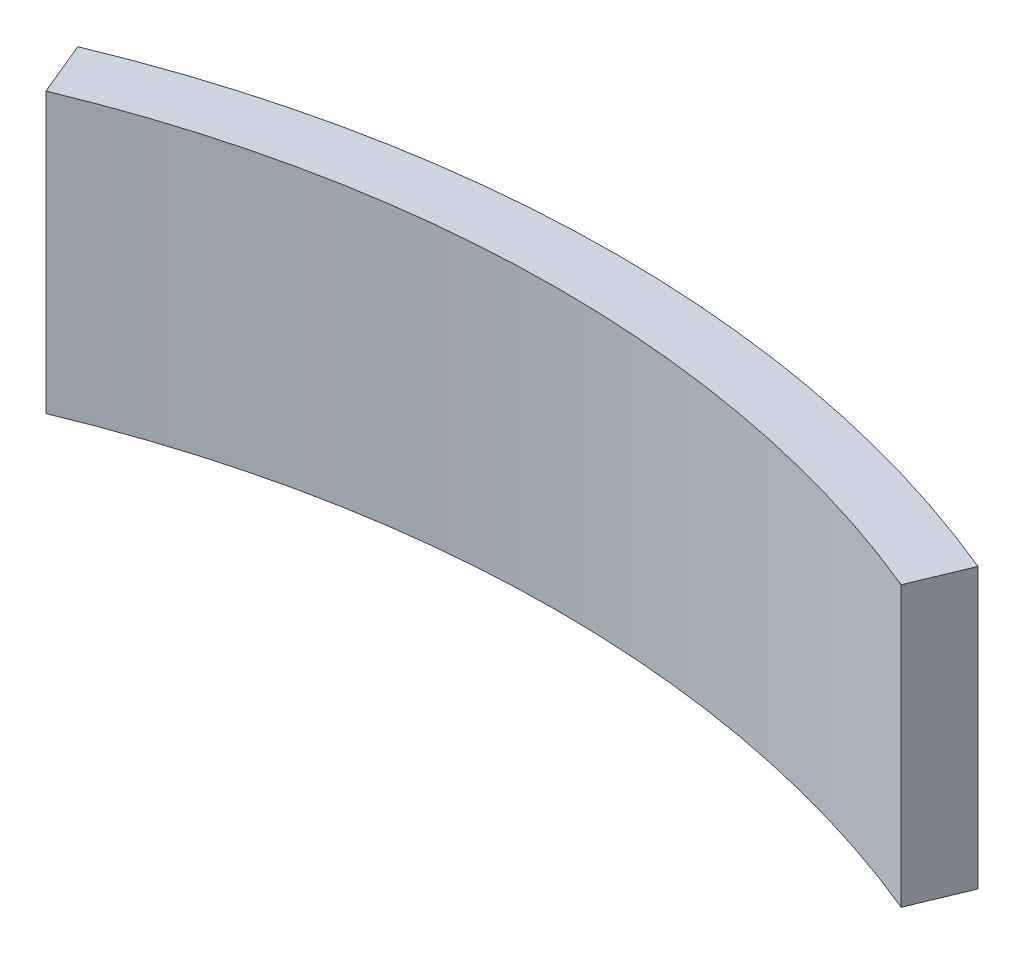
ISO-10303-21;
HEADER;
FILE_DESCRIPTION(('STEP AP214'),'2;1');
FILE_NAME('part.step','',(''),(''),'','','');
FILE_SCHEMA(('AUTOMOTIVE_DESIGN { 1 0 10303 214 1 1 1 1 }'));
ENDSEC;
DATA;
#1=APPLICATION_CONTEXT('core data for automotive mechanical design processes');
#2=APPLICATION_PROTOCOL_DEFINITION('international standard','automotive_design',2000,#1);
#3=PRODUCT_CONTEXT('',#1,'mechanical');
#4=PRODUCT('Part','Part','',(#3));
#5=PRODUCT_RELATED_PRODUCT_CATEGORY('part','',(#4));
#6=PRODUCT_DEFINITION_FORMATION('','',#4);
#7=PRODUCT_DEFINITION_CONTEXT('part definition',#1,'design');
#8=PRODUCT_DEFINITION('design','',#6,#7);
#9=PRODUCT_DEFINITION_SHAPE('','',#8);
#10=(LENGTH_UNIT() NAMED_UNIT(*) SI_UNIT(.MILLI.,.METRE.));
#11=(NAMED_UNIT(*) PLANE_ANGLE_UNIT() SI_UNIT($,.RADIAN.));
#12=(NAMED_UNIT(*) SI_UNIT($,.STERADIAN.) SOLID_ANGLE_UNIT());
#13=UNCERTAINTY_MEASURE_WITH_UNIT(LENGTH_MEASURE(1.E-05),#10,'distance_accuracy_value','');
#14=(GEOMETRIC_REPRESENTATION_CONTEXT(3) GLOBAL_UNCERTAINTY_ASSIGNED_CONTEXT((#13)) GLOBAL_UNIT_ASSIGNED_CONTEXT((#10,
#11,#12)) REPRESENTATION_CONTEXT('',''));
#15=CARTESIAN_POINT('',(0.,0.,0.));
#16=DIRECTION('',(0.,0.,1.));
#17=DIRECTION('',(1.,0.,0.));
#18=AXIS2_PLACEMENT_3D('',#15,#16,#17);
#19=CARTESIAN_POINT('',(0.,9.5,0.));
#20=DIRECTION('',(0.,-1.,0.));
#21=DIRECTION('',(0.,0.,-1.));
#22=AXIS2_PLACEMENT_3D('',#19,#20,#21);
#23=CYLINDRICAL_SURFACE('',#22,80.);
#24=CARTESIAN_POINT('',(0.,-9.5,0.));
#25=DIRECTION('',(0.,1.,0.));
#26=DIRECTION('',(0.,0.,1.));
#27=AXIS2_PLACEMENT_3D('',#24,#25,#26);
#28=CIRCLE('',#27,80.);
#29=CARTESIAN_POINT('',(30.6146745892072,-9.5,-73.9103626009029));
#30=VERTEX_POINT('',#29);
#31=CARTESIAN_POINT('',(-30.6146745892072,-9.5,-73.9103626009029));
#32=VERTEX_POINT('',#31);
#33=EDGE_CURVE('E98',#30,#32,#28,.T.);
#34=ORIENTED_EDGE('',*,*,#33,.T.);
#35=DIRECTION('',(0.,-1.,0.));
#36=VECTOR('',#35,1.);
#37=CARTESIAN_POINT('',(-30.6146745892072,9.5,-73.9103626009029));
#38=LINE('',#37,#36);
#39=CARTESIAN_POINT('',(-30.6146745892072,9.5,-73.9103626009029));
#40=VERTEX_POINT('',#39);
#41=EDGE_CURVE('E11',#40,#32,#38,.T.);
#42=ORIENTED_EDGE('',*,*,#41,.F.);
#43=CARTESIAN_POINT('',(0.,9.5,0.));
#44=DIRECTION('',(0.,1.,0.));
#45=DIRECTION('',(0.,0.,1.));
#46=AXIS2_PLACEMENT_3D('',#43,#44,#45);
#47=CIRCLE('',#46,80.);
#48=CARTESIAN_POINT('',(30.6146745892072,9.5,-73.9103626009029));
#49=VERTEX_POINT('',#48);
#50=EDGE_CURVE('E86',#49,#40,#47,.T.);
#51=ORIENTED_EDGE('',*,*,#50,.F.);
#52=DIRECTION('',(0.,-1.,0.));
#53=VECTOR('',#52,1.);
#54=CARTESIAN_POINT('',(30.6146745892072,9.5,-73.9103626009029));
#55=LINE('',#54,#53);
#56=EDGE_CURVE('E94',#49,#30,#55,.T.);
#57=ORIENTED_EDGE('',*,*,#56,.T.);
#58=EDGE_LOOP('',(#34,#42,#51,#57));
#59=FACE_BOUND('',#58,.T.);
#60=ADVANCED_FACE('F35',(#59),#23,.T.);
#61=CARTESIAN_POINT('',(-30.6146745892072,9.5,-73.9103626009029));
#62=DIRECTION('',(0.923879532511287,0.,-0.38268343236509));
#63=DIRECTION('',(-0.38268343236509,0.,-0.923879532511287));
#64=AXIS2_PLACEMENT_3D('',#61,#62,#63);
#65=PLANE('',#64);
#66=DIRECTION('',(0.38268343236509,0.,0.923879532511287));
#67=VECTOR('',#66,1.);
#68=CARTESIAN_POINT('',(-30.6146745892072,-9.5,-73.9103626009029));
#69=LINE('',#68,#67);
#70=CARTESIAN_POINT('',(-29.0839408597469,-9.5,-70.2148444708578));
#71=VERTEX_POINT('',#70);
#72=EDGE_CURVE('E90',#32,#71,#69,.T.);
#73=ORIENTED_EDGE('',*,*,#72,.T.);
#74=DIRECTION('',(0.,-1.,0.));
#75=VECTOR('',#74,1.);
#76=CARTESIAN_POINT('',(-29.0839408597469,9.5,-70.2148444708578));
#77=LINE('',#76,#75);
#78=CARTESIAN_POINT('',(-29.0839408597469,9.5,-70.2148444708578));
#79=VERTEX_POINT('',#78);
#80=EDGE_CURVE('E43',#79,#71,#77,.T.);
#81=ORIENTED_EDGE('',*,*,#80,.F.);
#82=DIRECTION('',(0.38268343236509,0.,0.923879532511287));
#83=VECTOR('',#82,1.);
#84=CARTESIAN_POINT('',(-30.6146745892072,9.5,-73.9103626009029));
#85=LINE('',#84,#83);
#86=EDGE_CURVE('E81',#40,#79,#85,.T.);
#87=ORIENTED_EDGE('',*,*,#86,.F.);
#88=ORIENTED_EDGE('',*,*,#41,.T.);
#89=EDGE_LOOP('',(#73,#81,#87,#88));
#90=FACE_BOUND('',#89,.T.);
#91=ADVANCED_FACE('F89',(#90),#65,.F.);
#92=CARTESIAN_POINT('',(0.,9.5,0.));
#93=DIRECTION('',(0.,-1.,0.));
#94=DIRECTION('',(0.,0.,-1.));
#95=AXIS2_PLACEMENT_3D('',#92,#93,#94);
#96=CYLINDRICAL_SURFACE('',#95,76.);
#97=CARTESIAN_POINT('',(0.,-9.5,0.));
#98=DIRECTION('',(0.,-1.,0.));
#99=DIRECTION('',(0.,0.,1.));
#100=AXIS2_PLACEMENT_3D('',#97,#98,#99);
#101=CIRCLE('',#100,76.);
#102=CARTESIAN_POINT('',(29.0839408597469,-9.5,-70.2148444708578));
#103=VERTEX_POINT('',#102);
#104=EDGE_CURVE('E68',#71,#103,#101,.T.);
#105=ORIENTED_EDGE('',*,*,#104,.T.);
#106=DIRECTION('',(0.,-1.,0.));
#107=VECTOR('',#106,1.);
#108=CARTESIAN_POINT('',(29.0839408597469,9.5,-70.2148444708578));
#109=LINE('',#108,#107);
#110=CARTESIAN_POINT('',(29.0839408597469,9.5,-70.2148444708578));
#111=VERTEX_POINT('',#110);
#112=EDGE_CURVE('E91',#111,#103,#109,.T.);
#113=ORIENTED_EDGE('',*,*,#112,.F.);
#114=CARTESIAN_POINT('',(0.,9.5,0.));
#115=DIRECTION('',(0.,-1.,0.));
#116=DIRECTION('',(0.,0.,1.));
#117=AXIS2_PLACEMENT_3D('',#114,#115,#116);
#118=CIRCLE('',#117,76.);
#119=EDGE_CURVE('E84',#79,#111,#118,.T.);
#120=ORIENTED_EDGE('',*,*,#119,.F.);
#121=ORIENTED_EDGE('',*,*,#80,.T.);
#122=EDGE_LOOP('',(#105,#113,#120,#121));
#123=FACE_BOUND('',#122,.T.);
#124=ADVANCED_FACE('F92',(#123),#96,.F.);
#125=CARTESIAN_POINT('',(30.6146745892072,9.5,-73.9103626009029));
#126=DIRECTION('',(-0.923879532511287,0.,-0.38268343236509));
#127=DIRECTION('',(-0.38268343236509,0.,0.923879532511287));
#128=AXIS2_PLACEMENT_3D('',#125,#126,#127);
#129=PLANE('',#128);
#130=DIRECTION('',(0.38268343236509,0.,-0.923879532511287));
#131=VECTOR('',#130,1.);
#132=CARTESIAN_POINT('',(30.6146745892072,-9.5,-73.9103626009029));
#133=LINE('',#132,#131);
#134=EDGE_CURVE('E74',#103,#30,#133,.T.);
#135=ORIENTED_EDGE('',*,*,#134,.T.);
#136=ORIENTED_EDGE('',*,*,#56,.F.);
#137=DIRECTION('',(0.38268343236509,0.,-0.923879532511287));
#138=VECTOR('',#137,1.);
#139=CARTESIAN_POINT('',(30.6146745892072,9.5,-73.9103626009029));
#140=LINE('',#139,#138);
#141=EDGE_CURVE('E51',#111,#49,#140,.T.);
#142=ORIENTED_EDGE('',*,*,#141,.F.);
#143=ORIENTED_EDGE('',*,*,#112,.T.);
#144=EDGE_LOOP('',(#135,#136,#142,#143));
#145=FACE_BOUND('',#144,.T.);
#146=ADVANCED_FACE('F105',(#145),#129,.F.);
#147=CARTESIAN_POINT('',(0.,9.5,0.));
#148=DIRECTION('',(0.,1.,0.));
#149=DIRECTION('',(0.,0.,1.));
#150=AXIS2_PLACEMENT_3D('',#147,#148,#149);
#151=PLANE('',#150);
#152=ORIENTED_EDGE('',*,*,#50,.T.);
#153=ORIENTED_EDGE('',*,*,#86,.T.);
#154=ORIENTED_EDGE('',*,*,#119,.T.);
#155=ORIENTED_EDGE('',*,*,#141,.T.);
#156=EDGE_LOOP('',(#152,#153,#154,#155));
#157=FACE_BOUND('',#156,.T.);
#158=ADVANCED_FACE('F82',(#157),#151,.T.);
#159=CARTESIAN_POINT('',(0.,-9.5,0.));
#160=DIRECTION('',(0.,1.,0.));
#161=DIRECTION('',(0.,0.,1.));
#162=AXIS2_PLACEMENT_3D('',#159,#160,#161);
#163=PLANE('',#162);
#164=ORIENTED_EDGE('',*,*,#33,.F.);
#165=ORIENTED_EDGE('',*,*,#134,.F.);
#166=ORIENTED_EDGE('',*,*,#104,.F.);
#167=ORIENTED_EDGE('',*,*,#72,.F.);
#168=EDGE_LOOP('',(#164,#165,#166,#167));
#169=FACE_BOUND('',#168,.T.);
#170=ADVANCED_FACE('F108',(#169),#163,.F.);
#171=CLOSED_SHELL('',(#60,#91,#124,#146,#158,#170));
#172=MANIFOLD_SOLID_BREP('B2',#171);
#173=ADVANCED_BREP_SHAPE_REPRESENTATION('',(#18,#172),#14);
#174=SHAPE_DEFINITION_REPRESENTATION(#9,#173);
ENDSEC;
END-ISO-10303-21;
